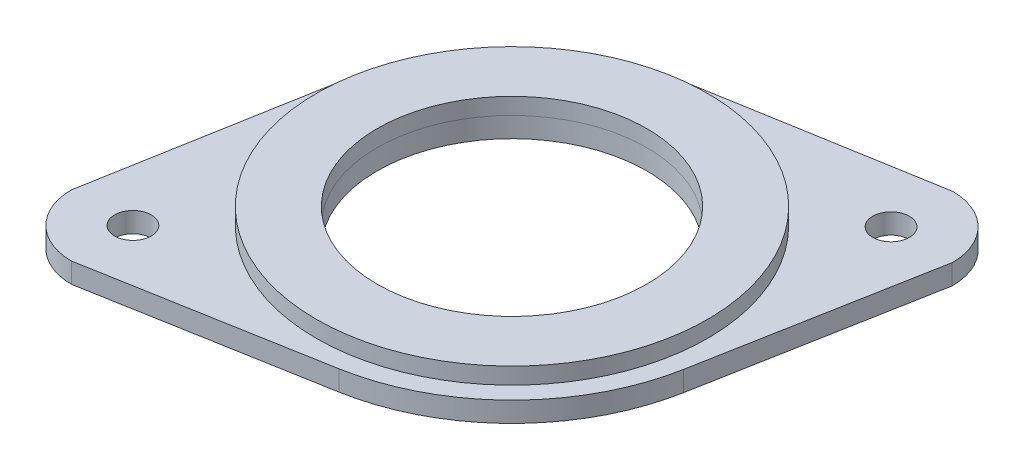
ISO-10303-21;
HEADER;
FILE_DESCRIPTION(('STEP AP214'),'2;1');
FILE_NAME('part.step','',(''),(''),'','','');
FILE_SCHEMA(('AUTOMOTIVE_DESIGN { 1 0 10303 214 1 1 1 1 }'));
ENDSEC;
DATA;
#1=APPLICATION_CONTEXT('core data for automotive mechanical design processes');
#2=APPLICATION_PROTOCOL_DEFINITION('international standard','automotive_design',2000,#1);
#3=PRODUCT_CONTEXT('',#1,'mechanical');
#4=PRODUCT('Part','Part','',(#3));
#5=PRODUCT_RELATED_PRODUCT_CATEGORY('part','',(#4));
#6=PRODUCT_DEFINITION_FORMATION('','',#4);
#7=PRODUCT_DEFINITION_CONTEXT('part definition',#1,'design');
#8=PRODUCT_DEFINITION('design','',#6,#7);
#9=PRODUCT_DEFINITION_SHAPE('','',#8);
#10=(LENGTH_UNIT() NAMED_UNIT(*) SI_UNIT(.MILLI.,.METRE.));
#11=(NAMED_UNIT(*) PLANE_ANGLE_UNIT() SI_UNIT($,.RADIAN.));
#12=(NAMED_UNIT(*) SI_UNIT($,.STERADIAN.) SOLID_ANGLE_UNIT());
#13=UNCERTAINTY_MEASURE_WITH_UNIT(LENGTH_MEASURE(1.E-05),#10,'distance_accuracy_value','');
#14=(GEOMETRIC_REPRESENTATION_CONTEXT(3) GLOBAL_UNCERTAINTY_ASSIGNED_CONTEXT((#13)) GLOBAL_UNIT_ASSIGNED_CONTEXT((#10,
#11,#12)) REPRESENTATION_CONTEXT('',''));
#15=CARTESIAN_POINT('',(0.,0.,0.));
#16=DIRECTION('',(0.,0.,1.));
#17=DIRECTION('',(1.,0.,0.));
#18=AXIS2_PLACEMENT_3D('',#15,#16,#17);
#19=CARTESIAN_POINT('',(15.5976424274225,1.65,-15.4017385611583));
#20=DIRECTION('',(0.,-1.,0.));
#21=DIRECTION('',(0.,0.,-1.));
#22=AXIS2_PLACEMENT_3D('',#19,#20,#21);
#23=CYLINDRICAL_SURFACE('',#22,5.03499820531251);
#24=CARTESIAN_POINT('',(15.5976424274225,0.,-15.4017385611583));
#25=DIRECTION('',(0.,1.,0.));
#26=DIRECTION('',(0.,0.,1.));
#27=AXIS2_PLACEMENT_3D('',#24,#25,#26);
#28=CIRCLE('',#27,5.03499820531251);
#29=CARTESIAN_POINT('',(15.62946099565,0.,-20.4366362270713));
#30=VERTEX_POINT('',#29);
#31=CARTESIAN_POINT('',(20.6325400933355,0.,-15.3699199929307));
#32=VERTEX_POINT('',#31);
#33=EDGE_CURVE('E159',#30,#32,#28,.F.);
#34=ORIENTED_EDGE('',*,*,#33,.F.);
#35=DIRECTION('',(0.,-1.,0.));
#36=VECTOR('',#35,1.);
#37=CARTESIAN_POINT('',(15.62946099565,1.65,-20.4366362270713));
#38=LINE('',#37,#36);
#39=CARTESIAN_POINT('',(15.62946099565,1.65,-20.4366362270713));
#40=VERTEX_POINT('',#39);
#41=EDGE_CURVE('E12',#40,#30,#38,.T.);
#42=ORIENTED_EDGE('',*,*,#41,.F.);
#43=CARTESIAN_POINT('',(15.5976424274225,1.65,-15.4017385611583));
#44=DIRECTION('',(0.,1.,0.));
#45=DIRECTION('',(0.,0.,1.));
#46=AXIS2_PLACEMENT_3D('',#43,#44,#45);
#47=CIRCLE('',#46,5.03499820531251);
#48=CARTESIAN_POINT('',(20.6325400933355,1.65,-15.3699199929307));
#49=VERTEX_POINT('',#48);
#50=EDGE_CURVE('E239',#40,#49,#47,.F.);
#51=ORIENTED_EDGE('',*,*,#50,.T.);
#52=DIRECTION('',(0.,-1.,0.));
#53=VECTOR('',#52,1.);
#54=CARTESIAN_POINT('',(20.6325400933355,1.65,-15.3699199929307));
#55=LINE('',#54,#53);
#56=EDGE_CURVE('E61',#49,#32,#55,.T.);
#57=ORIENTED_EDGE('',*,*,#56,.T.);
#58=EDGE_LOOP('',(#34,#42,#51,#57));
#59=FACE_BOUND('',#58,.T.);
#60=ADVANCED_FACE('F44',(#59),#23,.T.);
#61=CARTESIAN_POINT('',(-2.95868693394676,1.65,-17.2480773315916));
#62=DIRECTION('',(0.169067824794288,0.,0.985604418932529));
#63=DIRECTION('',(0.985604418932529,0.,-0.169067824794288));
#64=AXIS2_PLACEMENT_3D('',#61,#62,#63);
#65=PLANE('',#64);
#66=DIRECTION('',(-0.985604418932529,0.,0.169067824794288));
#67=VECTOR('',#66,1.);
#68=CARTESIAN_POINT('',(-2.95868693394676,0.,-17.2480773315916));
#69=LINE('',#68,#67);
#70=CARTESIAN_POINT('',(-2.95868693394674,0.,-17.2480773315916));
#71=VERTEX_POINT('',#70);
#72=EDGE_CURVE('E156',#30,#71,#69,.T.);
#73=ORIENTED_EDGE('',*,*,#72,.T.);
#74=DIRECTION('',(0.,-1.,0.));
#75=VECTOR('',#74,1.);
#76=CARTESIAN_POINT('',(-2.95868693394674,1.65,-17.2480773315916));
#77=LINE('',#76,#75);
#78=CARTESIAN_POINT('',(-2.95868693394674,1.65,-17.2480773315916));
#79=VERTEX_POINT('',#78);
#80=EDGE_CURVE('E53',#79,#71,#77,.T.);
#81=ORIENTED_EDGE('',*,*,#80,.F.);
#82=DIRECTION('',(-0.985604418932529,0.,0.169067824794288));
#83=VECTOR('',#82,1.);
#84=CARTESIAN_POINT('',(-2.95868693394676,1.65,-17.2480773315916));
#85=LINE('',#84,#83);
#86=EDGE_CURVE('E241',#40,#79,#85,.T.);
#87=ORIENTED_EDGE('',*,*,#86,.F.);
#88=ORIENTED_EDGE('',*,*,#41,.T.);
#89=EDGE_LOOP('',(#73,#81,#87,#88));
#90=FACE_BOUND('',#89,.T.);
#91=ADVANCED_FACE('F157',(#90),#65,.F.);
#92=CARTESIAN_POINT('',(0.,1.65,0.));
#93=DIRECTION('',(0.,-1.,0.));
#94=DIRECTION('',(0.,0.,-1.));
#95=AXIS2_PLACEMENT_3D('',#92,#93,#94);
#96=CYLINDRICAL_SURFACE('',#95,17.5000000002764);
#97=CARTESIAN_POINT('',(0.,0.,0.));
#98=DIRECTION('',(0.,1.,0.));
#99=DIRECTION('',(0.,0.,1.));
#100=AXIS2_PLACEMENT_3D('',#97,#98,#99);
#101=CIRCLE('',#100,17.5000000002764);
#102=CARTESIAN_POINT('',(-17.2290355584867,0.,-3.06762672665272));
#103=VERTEX_POINT('',#102);
#104=EDGE_CURVE('E150',#71,#103,#101,.T.);
#105=ORIENTED_EDGE('',*,*,#104,.T.);
#106=DIRECTION('',(0.,-1.,0.));
#107=VECTOR('',#106,1.);
#108=CARTESIAN_POINT('',(-17.2290355584867,1.65,-3.06762672665272));
#109=LINE('',#108,#107);
#110=CARTESIAN_POINT('',(-17.2290355584867,1.65,-3.06762672665272));
#111=VERTEX_POINT('',#110);
#112=EDGE_CURVE('E142',#111,#103,#109,.T.);
#113=ORIENTED_EDGE('',*,*,#112,.F.);
#114=CARTESIAN_POINT('',(0.,1.65,0.));
#115=DIRECTION('',(0.,1.,0.));
#116=DIRECTION('',(0.,0.,1.));
#117=AXIS2_PLACEMENT_3D('',#114,#115,#116);
#118=CIRCLE('',#117,17.5000000002764);
#119=EDGE_CURVE('E152',#79,#111,#118,.T.);
#120=ORIENTED_EDGE('',*,*,#119,.F.);
#121=ORIENTED_EDGE('',*,*,#80,.T.);
#122=EDGE_LOOP('',(#105,#113,#120,#121));
#123=FACE_BOUND('',#122,.T.);
#124=ADVANCED_FACE('F148',(#123),#96,.T.);
#125=CARTESIAN_POINT('',(-17.2290355584867,1.65,-3.06762672665272));
#126=DIRECTION('',(-0.984516317612263,0.,-0.175292955805959));
#127=DIRECTION('',(-0.175292955805959,0.,0.984516317612263));
#128=AXIS2_PLACEMENT_3D('',#125,#126,#127);
#129=PLANE('',#128);
#130=DIRECTION('',(0.175292955805959,0.,-0.984516317612263));
#131=VECTOR('',#130,1.);
#132=CARTESIAN_POINT('',(-17.2290355584867,0.,-3.06762672665272));
#133=LINE('',#132,#131);
#134=CARTESIAN_POINT('',(-20.5349982053125,0.,15.5));
#135=VERTEX_POINT('',#134);
#136=EDGE_CURVE('E161',#135,#103,#133,.T.);
#137=ORIENTED_EDGE('',*,*,#136,.F.);
#138=DIRECTION('',(0.,-1.,0.));
#139=VECTOR('',#138,1.);
#140=CARTESIAN_POINT('',(-20.5349982053125,1.65,15.5));
#141=LINE('',#140,#139);
#142=CARTESIAN_POINT('',(-20.5349982053125,1.65,15.5));
#143=VERTEX_POINT('',#142);
#144=EDGE_CURVE('E136',#143,#135,#141,.T.);
#145=ORIENTED_EDGE('',*,*,#144,.F.);
#146=DIRECTION('',(0.175292955805959,0.,-0.984516317612263));
#147=VECTOR('',#146,1.);
#148=CARTESIAN_POINT('',(-17.2290355584867,1.65,-3.06762672665272));
#149=LINE('',#148,#147);
#150=EDGE_CURVE('E248',#143,#111,#149,.T.);
#151=ORIENTED_EDGE('',*,*,#150,.T.);
#152=ORIENTED_EDGE('',*,*,#112,.T.);
#153=EDGE_LOOP('',(#137,#145,#151,#152));
#154=FACE_BOUND('',#153,.T.);
#155=ADVANCED_FACE('F210',(#154),#129,.T.);
#156=CARTESIAN_POINT('',(-15.5,1.65,15.5));
#157=DIRECTION('',(0.,-1.,0.));
#158=DIRECTION('',(0.,0.,-1.));
#159=AXIS2_PLACEMENT_3D('',#156,#157,#158);
#160=CYLINDRICAL_SURFACE('',#159,5.03499820531251);
#161=CARTESIAN_POINT('',(-15.5,0.,15.5));
#162=DIRECTION('',(0.,1.,0.));
#163=DIRECTION('',(0.,0.,1.));
#164=AXIS2_PLACEMENT_3D('',#161,#162,#163);
#165=CIRCLE('',#164,5.03499820531251);
#166=CARTESIAN_POINT('',(-15.5,0.,20.5349982053125));
#167=VERTEX_POINT('',#166);
#168=EDGE_CURVE('E168',#135,#167,#165,.T.);
#169=ORIENTED_EDGE('',*,*,#168,.T.);
#170=DIRECTION('',(0.,-1.,0.));
#171=VECTOR('',#170,1.);
#172=CARTESIAN_POINT('',(-15.5,1.65,20.5349982053125));
#173=LINE('',#172,#171);
#174=CARTESIAN_POINT('',(-15.5,1.65,20.5349982053125));
#175=VERTEX_POINT('',#174);
#176=EDGE_CURVE('E134',#175,#167,#173,.T.);
#177=ORIENTED_EDGE('',*,*,#176,.F.);
#178=CARTESIAN_POINT('',(-15.5,1.65,15.5));
#179=DIRECTION('',(0.,1.,0.));
#180=DIRECTION('',(0.,0.,1.));
#181=AXIS2_PLACEMENT_3D('',#178,#179,#180);
#182=CIRCLE('',#181,5.03499820531251);
#183=EDGE_CURVE('E127',#143,#175,#182,.T.);
#184=ORIENTED_EDGE('',*,*,#183,.F.);
#185=ORIENTED_EDGE('',*,*,#144,.T.);
#186=EDGE_LOOP('',(#169,#177,#184,#185));
#187=FACE_BOUND('',#186,.T.);
#188=ADVANCED_FACE('F213',(#187),#160,.T.);
#189=CARTESIAN_POINT('',(3.06762672665272,1.65,17.2290355584867));
#190=DIRECTION('',(-0.175292955805959,0.,-0.984516317612263));
#191=DIRECTION('',(-0.984516317612263,0.,0.175292955805959));
#192=AXIS2_PLACEMENT_3D('',#189,#190,#191);
#193=PLANE('',#192);
#194=DIRECTION('',(0.984516317612263,0.,-0.175292955805959));
#195=VECTOR('',#194,1.);
#196=CARTESIAN_POINT('',(3.06762672665272,0.,17.2290355584867));
#197=LINE('',#196,#195);
#198=CARTESIAN_POINT('',(3.06762672665272,0.,17.2290355584867));
#199=VERTEX_POINT('',#198);
#200=EDGE_CURVE('E133',#167,#199,#197,.T.);
#201=ORIENTED_EDGE('',*,*,#200,.T.);
#202=DIRECTION('',(0.,-1.,0.));
#203=VECTOR('',#202,1.);
#204=CARTESIAN_POINT('',(3.06762672665272,1.65,17.2290355584867));
#205=LINE('',#204,#203);
#206=CARTESIAN_POINT('',(3.06762672665272,1.65,17.2290355584867));
#207=VERTEX_POINT('',#206);
#208=EDGE_CURVE('E115',#207,#199,#205,.T.);
#209=ORIENTED_EDGE('',*,*,#208,.F.);
#210=DIRECTION('',(0.984516317612263,0.,-0.175292955805959));
#211=VECTOR('',#210,1.);
#212=CARTESIAN_POINT('',(3.06762672665272,1.65,17.2290355584867));
#213=LINE('',#212,#211);
#214=EDGE_CURVE('E120',#175,#207,#213,.T.);
#215=ORIENTED_EDGE('',*,*,#214,.F.);
#216=ORIENTED_EDGE('',*,*,#176,.T.);
#217=EDGE_LOOP('',(#201,#209,#215,#216));
#218=FACE_BOUND('',#217,.T.);
#219=ADVANCED_FACE('F132',(#218),#193,.F.);
#220=CARTESIAN_POINT('',(0.,1.65,0.));
#221=DIRECTION('',(0.,-1.,0.));
#222=DIRECTION('',(0.,0.,-1.));
#223=AXIS2_PLACEMENT_3D('',#220,#221,#222);
#224=CYLINDRICAL_SURFACE('',#223,17.5000000002763);
#225=CARTESIAN_POINT('',(0.,0.,0.));
#226=DIRECTION('',(0.,1.,0.));
#227=DIRECTION('',(0.,0.,1.));
#228=AXIS2_PLACEMENT_3D('',#225,#226,#227);
#229=CIRCLE('',#228,17.5000000002763);
#230=CARTESIAN_POINT('',(17.209305722817,0.,3.17644400994102));
#231=VERTEX_POINT('',#230);
#232=EDGE_CURVE('E172',#199,#231,#229,.T.);
#233=ORIENTED_EDGE('',*,*,#232,.T.);
#234=DIRECTION('',(0.,-1.,0.));
#235=VECTOR('',#234,1.);
#236=CARTESIAN_POINT('',(17.209305722817,1.65,3.17644400994102));
#237=LINE('',#236,#235);
#238=CARTESIAN_POINT('',(17.209305722817,1.65,3.17644400994102));
#239=VERTEX_POINT('',#238);
#240=EDGE_CURVE('E87',#239,#231,#237,.T.);
#241=ORIENTED_EDGE('',*,*,#240,.F.);
#242=CARTESIAN_POINT('',(0.,1.65,0.));
#243=DIRECTION('',(0.,1.,0.));
#244=DIRECTION('',(0.,0.,1.));
#245=AXIS2_PLACEMENT_3D('',#242,#243,#244);
#246=CIRCLE('',#245,17.5000000002763);
#247=EDGE_CURVE('E111',#207,#239,#246,.T.);
#248=ORIENTED_EDGE('',*,*,#247,.F.);
#249=ORIENTED_EDGE('',*,*,#208,.T.);
#250=EDGE_LOOP('',(#233,#241,#248,#249));
#251=FACE_BOUND('',#250,.T.);
#252=ADVANCED_FACE('F113',(#251),#224,.T.);
#253=CARTESIAN_POINT('',(-15.5,1.65,15.5));
#254=DIRECTION('',(0.,-1.,0.));
#255=DIRECTION('',(0.,0.,-1.));
#256=AXIS2_PLACEMENT_3D('',#253,#254,#255);
#257=CYLINDRICAL_SURFACE('',#256,1.5);
#258=CARTESIAN_POINT('',(-15.5,1.65,15.5));
#259=DIRECTION('',(0.,1.,0.));
#260=DIRECTION('',(0.,0.,1.));
#261=AXIS2_PLACEMENT_3D('',#258,#259,#260);
#262=CIRCLE('',#261,1.5);
#263=CARTESIAN_POINT('',(-15.5,1.65,17.));
#264=VERTEX_POINT('',#263);
#265=EDGE_CURVE('E238',#264,#264,#262,.T.);
#266=ORIENTED_EDGE('',*,*,#265,.T.);
#267=EDGE_LOOP('',(#266));
#268=FACE_BOUND('',#267,.T.);
#269=CARTESIAN_POINT('',(-15.5,0.,15.5));
#270=DIRECTION('',(0.,1.,0.));
#271=DIRECTION('',(0.,0.,1.));
#272=AXIS2_PLACEMENT_3D('',#269,#270,#271);
#273=CIRCLE('',#272,1.5);
#274=CARTESIAN_POINT('',(-15.5,0.,17.));
#275=VERTEX_POINT('',#274);
#276=EDGE_CURVE('E163',#275,#275,#273,.T.);
#277=ORIENTED_EDGE('',*,*,#276,.F.);
#278=EDGE_LOOP('',(#277));
#279=FACE_BOUND('',#278,.T.);
#280=ADVANCED_FACE('F189',(#268,#279),#257,.F.);
#281=CARTESIAN_POINT('',(15.5976424274225,1.65,-15.4017385611583));
#282=DIRECTION('',(0.,-1.,0.));
#283=DIRECTION('',(0.,0.,-1.));
#284=AXIS2_PLACEMENT_3D('',#281,#282,#283);
#285=CYLINDRICAL_SURFACE('',#284,1.49999999999998);
#286=CARTESIAN_POINT('',(15.5976424274225,1.65,-15.4017385611583));
#287=DIRECTION('',(0.,1.,0.));
#288=DIRECTION('',(0.,0.,1.));
#289=AXIS2_PLACEMENT_3D('',#286,#287,#288);
#290=CIRCLE('',#289,1.49999999999998);
#291=CARTESIAN_POINT('',(15.5976424274225,1.65,-13.9017385611583));
#292=VERTEX_POINT('',#291);
#293=EDGE_CURVE('E236',#292,#292,#290,.T.);
#294=ORIENTED_EDGE('',*,*,#293,.T.);
#295=EDGE_LOOP('',(#294));
#296=FACE_BOUND('',#295,.T.);
#297=CARTESIAN_POINT('',(15.5976424274225,0.,-15.4017385611583));
#298=DIRECTION('',(0.,1.,0.));
#299=DIRECTION('',(0.,0.,1.));
#300=AXIS2_PLACEMENT_3D('',#297,#298,#299);
#301=CIRCLE('',#300,1.49999999999998);
#302=CARTESIAN_POINT('',(15.5976424274225,0.,-13.9017385611583));
#303=VERTEX_POINT('',#302);
#304=EDGE_CURVE('E182',#303,#303,#301,.T.);
#305=ORIENTED_EDGE('',*,*,#304,.F.);
#306=EDGE_LOOP('',(#305));
#307=FACE_BOUND('',#306,.T.);
#308=ADVANCED_FACE('F191',(#296,#307),#285,.F.);
#309=CARTESIAN_POINT('',(0.,1.65,0.));
#310=DIRECTION('',(0.,-1.,0.));
#311=DIRECTION('',(0.,0.,-1.));
#312=AXIS2_PLACEMENT_3D('',#309,#310,#311);
#313=CYLINDRICAL_SURFACE('',#312,11.025);
#314=CARTESIAN_POINT('',(0.,1.65,0.));
#315=DIRECTION('',(0.,1.,0.));
#316=DIRECTION('',(0.,0.,1.));
#317=AXIS2_PLACEMENT_3D('',#314,#315,#316);
#318=CIRCLE('',#317,11.025);
#319=CARTESIAN_POINT('',(0.,1.65,11.025));
#320=VERTEX_POINT('',#319);
#321=EDGE_CURVE('E176',#320,#320,#318,.T.);
#322=ORIENTED_EDGE('',*,*,#321,.T.);
#323=EDGE_LOOP('',(#322));
#324=FACE_BOUND('',#323,.T.);
#325=CARTESIAN_POINT('',(0.,0.,0.));
#326=DIRECTION('',(0.,1.,0.));
#327=DIRECTION('',(0.,0.,1.));
#328=AXIS2_PLACEMENT_3D('',#325,#326,#327);
#329=CIRCLE('',#328,11.025);
#330=CARTESIAN_POINT('',(0.,0.,11.025));
#331=VERTEX_POINT('',#330);
#332=EDGE_CURVE('E179',#331,#331,#329,.T.);
#333=ORIENTED_EDGE('',*,*,#332,.F.);
#334=EDGE_LOOP('',(#333));
#335=FACE_BOUND('',#334,.T.);
#336=ADVANCED_FACE('F46',(#324,#335),#313,.F.);
#337=CARTESIAN_POINT('',(17.209305722817,1.65,3.17644400994103));
#338=DIRECTION('',(0.983388898431157,0.,0.181511086279478));
#339=DIRECTION('',(0.181511086279478,0.,-0.983388898431157));
#340=AXIS2_PLACEMENT_3D('',#337,#338,#339);
#341=PLANE('',#340);
#342=DIRECTION('',(-0.181511086279478,0.,0.983388898431157));
#343=VECTOR('',#342,1.);
#344=CARTESIAN_POINT('',(17.209305722817,0.,3.17644400994103));
#345=LINE('',#344,#343);
#346=EDGE_CURVE('E174',#32,#231,#345,.T.);
#347=ORIENTED_EDGE('',*,*,#346,.F.);
#348=ORIENTED_EDGE('',*,*,#56,.F.);
#349=DIRECTION('',(-0.181511086279478,0.,0.983388898431157));
#350=VECTOR('',#349,1.);
#351=CARTESIAN_POINT('',(17.209305722817,1.65,3.17644400994103));
#352=LINE('',#351,#350);
#353=EDGE_CURVE('E119',#49,#239,#352,.T.);
#354=ORIENTED_EDGE('',*,*,#353,.T.);
#355=ORIENTED_EDGE('',*,*,#240,.T.);
#356=EDGE_LOOP('',(#347,#348,#354,#355));
#357=FACE_BOUND('',#356,.T.);
#358=ADVANCED_FACE('F220',(#357),#341,.T.);
#359=CARTESIAN_POINT('',(0.,1.65,0.));
#360=DIRECTION('',(0.,1.,0.));
#361=DIRECTION('',(0.,0.,1.));
#362=AXIS2_PLACEMENT_3D('',#359,#360,#361);
#363=PLANE('',#362);
#364=ORIENTED_EDGE('',*,*,#321,.F.);
#365=EDGE_LOOP('',(#364));
#366=FACE_BOUND('',#365,.T.);
#367=ORIENTED_EDGE('',*,*,#293,.F.);
#368=EDGE_LOOP('',(#367));
#369=FACE_BOUND('',#368,.T.);
#370=ORIENTED_EDGE('',*,*,#265,.F.);
#371=EDGE_LOOP('',(#370));
#372=FACE_BOUND('',#371,.T.);
#373=ORIENTED_EDGE('',*,*,#50,.F.);
#374=ORIENTED_EDGE('',*,*,#86,.T.);
#375=ORIENTED_EDGE('',*,*,#119,.T.);
#376=ORIENTED_EDGE('',*,*,#150,.F.);
#377=ORIENTED_EDGE('',*,*,#183,.T.);
#378=ORIENTED_EDGE('',*,*,#214,.T.);
#379=ORIENTED_EDGE('',*,*,#247,.T.);
#380=ORIENTED_EDGE('',*,*,#353,.F.);
#381=EDGE_LOOP('',(#373,#374,#375,#376,#377,#378,#379,#380));
#382=FACE_BOUND('',#381,.T.);
#383=ADVANCED_FACE('F124',(#366,#369,#372,#382),#363,.T.);
#384=CARTESIAN_POINT('',(0.,0.,0.));
#385=DIRECTION('',(0.,1.,0.));
#386=DIRECTION('',(0.,0.,1.));
#387=AXIS2_PLACEMENT_3D('',#384,#385,#386);
#388=PLANE('',#387);
#389=ORIENTED_EDGE('',*,*,#332,.T.);
#390=EDGE_LOOP('',(#389));
#391=FACE_BOUND('',#390,.T.);
#392=ORIENTED_EDGE('',*,*,#304,.T.);
#393=EDGE_LOOP('',(#392));
#394=FACE_BOUND('',#393,.T.);
#395=ORIENTED_EDGE('',*,*,#276,.T.);
#396=EDGE_LOOP('',(#395));
#397=FACE_BOUND('',#396,.T.);
#398=ORIENTED_EDGE('',*,*,#33,.T.);
#399=ORIENTED_EDGE('',*,*,#346,.T.);
#400=ORIENTED_EDGE('',*,*,#232,.F.);
#401=ORIENTED_EDGE('',*,*,#200,.F.);
#402=ORIENTED_EDGE('',*,*,#168,.F.);
#403=ORIENTED_EDGE('',*,*,#136,.T.);
#404=ORIENTED_EDGE('',*,*,#104,.F.);
#405=ORIENTED_EDGE('',*,*,#72,.F.);
#406=EDGE_LOOP('',(#398,#399,#400,#401,#402,#403,#404,#405));
#407=FACE_BOUND('',#406,.T.);
#408=ADVANCED_FACE('F187',(#391,#394,#397,#407),#388,.F.);
#409=CLOSED_SHELL('',(#60,#91,#124,#155,#188,#219,#252,#280,#308,#336,#358,#383,#408));
#410=MANIFOLD_SOLID_BREP('B2',#409);
#411=CARTESIAN_POINT('',(0.,3.,0.));
#412=DIRECTION('',(0.,1.,0.));
#413=DIRECTION('',(0.,0.,1.));
#414=AXIS2_PLACEMENT_3D('',#411,#412,#413);
#415=PLANE('',#414);
#416=CARTESIAN_POINT('',(0.,3.,0.));
#417=DIRECTION('',(0.,1.,0.));
#418=DIRECTION('',(0.,0.,1.));
#419=AXIS2_PLACEMENT_3D('',#416,#417,#418);
#420=CIRCLE('',#419,16.);
#421=CARTESIAN_POINT('',(0.,3.,16.));
#422=VERTEX_POINT('',#421);
#423=EDGE_CURVE('E43',#422,#422,#420,.T.);
#424=ORIENTED_EDGE('',*,*,#423,.T.);
#425=EDGE_LOOP('',(#424));
#426=FACE_BOUND('',#425,.T.);
#427=CARTESIAN_POINT('',(0.,3.,0.));
#428=DIRECTION('',(0.,1.,0.));
#429=DIRECTION('',(0.,0.,1.));
#430=AXIS2_PLACEMENT_3D('',#427,#428,#429);
#431=CIRCLE('',#430,11.025);
#432=CARTESIAN_POINT('',(0.,3.,11.025));
#433=VERTEX_POINT('',#432);
#434=EDGE_CURVE('E348',#433,#433,#431,.T.);
#435=ORIENTED_EDGE('',*,*,#434,.F.);
#436=EDGE_LOOP('',(#435));
#437=FACE_BOUND('',#436,.T.);
#438=ADVANCED_FACE('F337',(#426,#437),#415,.T.);
#439=CARTESIAN_POINT('',(0.,1.65,0.));
#440=DIRECTION('',(0.,1.,0.));
#441=DIRECTION('',(0.,0.,1.));
#442=AXIS2_PLACEMENT_3D('',#439,#440,#441);
#443=PLANE('',#442);
#444=CARTESIAN_POINT('',(0.,1.65,0.));
#445=DIRECTION('',(0.,1.,0.));
#446=DIRECTION('',(0.,0.,1.));
#447=AXIS2_PLACEMENT_3D('',#444,#445,#446);
#448=CIRCLE('',#447,16.);
#449=CARTESIAN_POINT('',(0.,1.65,16.));
#450=VERTEX_POINT('',#449);
#451=EDGE_CURVE('E341',#450,#450,#448,.T.);
#452=ORIENTED_EDGE('',*,*,#451,.F.);
#453=EDGE_LOOP('',(#452));
#454=FACE_BOUND('',#453,.T.);
#455=CARTESIAN_POINT('',(0.,1.65,0.));
#456=DIRECTION('',(0.,1.,0.));
#457=DIRECTION('',(0.,0.,1.));
#458=AXIS2_PLACEMENT_3D('',#455,#456,#457);
#459=CIRCLE('',#458,11.025);
#460=CARTESIAN_POINT('',(0.,1.65,11.025));
#461=VERTEX_POINT('',#460);
#462=EDGE_CURVE('E350',#461,#461,#459,.T.);
#463=ORIENTED_EDGE('',*,*,#462,.T.);
#464=EDGE_LOOP('',(#463));
#465=FACE_BOUND('',#464,.T.);
#466=ADVANCED_FACE('F360',(#454,#465),#443,.F.);
#467=CARTESIAN_POINT('',(0.,3.,0.));
#468=DIRECTION('',(0.,-1.,0.));
#469=DIRECTION('',(0.,0.,-1.));
#470=AXIS2_PLACEMENT_3D('',#467,#468,#469);
#471=CYLINDRICAL_SURFACE('',#470,16.);
#472=ORIENTED_EDGE('',*,*,#423,.F.);
#473=EDGE_LOOP('',(#472));
#474=FACE_BOUND('',#473,.T.);
#475=ORIENTED_EDGE('',*,*,#451,.T.);
#476=EDGE_LOOP('',(#475));
#477=FACE_BOUND('',#476,.T.);
#478=ADVANCED_FACE('F339',(#474,#477),#471,.T.);
#479=CARTESIAN_POINT('',(0.,3.,0.));
#480=DIRECTION('',(0.,-1.,0.));
#481=DIRECTION('',(0.,0.,-1.));
#482=AXIS2_PLACEMENT_3D('',#479,#480,#481);
#483=CYLINDRICAL_SURFACE('',#482,11.025);
#484=ORIENTED_EDGE('',*,*,#434,.T.);
#485=EDGE_LOOP('',(#484));
#486=FACE_BOUND('',#485,.T.);
#487=ORIENTED_EDGE('',*,*,#462,.F.);
#488=EDGE_LOOP('',(#487));
#489=FACE_BOUND('',#488,.T.);
#490=ADVANCED_FACE('F356',(#486,#489),#483,.F.);
#491=CLOSED_SHELL('',(#438,#466,#478,#490));
#492=MANIFOLD_SOLID_BREP('B6',#491);
#493=ADVANCED_BREP_SHAPE_REPRESENTATION('',(#18,#410,#492),#14);
#494=SHAPE_DEFINITION_REPRESENTATION(#9,#493);
ENDSEC;
END-ISO-10303-21;
